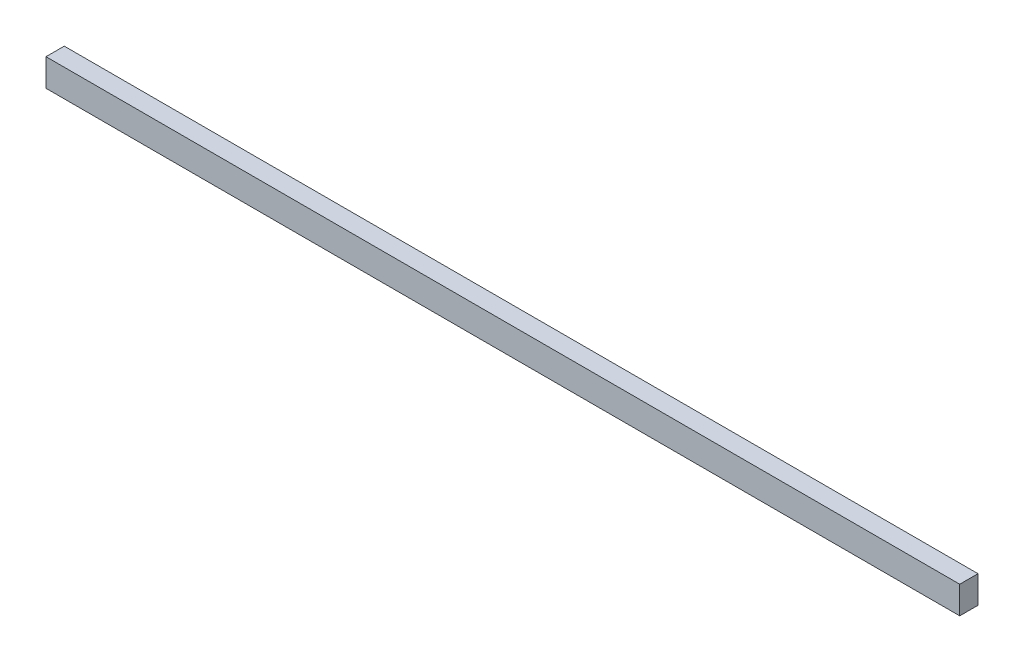
ISO-10303-21;
HEADER;
FILE_DESCRIPTION(('STEP AP214'),'2;1');
FILE_NAME('part.step','',(''),(''),'','','');
FILE_SCHEMA(('AUTOMOTIVE_DESIGN { 1 0 10303 214 1 1 1 1 }'));
ENDSEC;
DATA;
#1=APPLICATION_CONTEXT('core data for automotive mechanical design processes');
#2=APPLICATION_PROTOCOL_DEFINITION('international standard','automotive_design',2000,#1);
#3=PRODUCT_CONTEXT('',#1,'mechanical');
#4=PRODUCT('Part','Part','',(#3));
#5=PRODUCT_RELATED_PRODUCT_CATEGORY('part','',(#4));
#6=PRODUCT_DEFINITION_FORMATION('','',#4);
#7=PRODUCT_DEFINITION_CONTEXT('part definition',#1,'design');
#8=PRODUCT_DEFINITION('design','',#6,#7);
#9=PRODUCT_DEFINITION_SHAPE('','',#8);
#10=(LENGTH_UNIT() NAMED_UNIT(*) SI_UNIT(.MILLI.,.METRE.));
#11=(NAMED_UNIT(*) PLANE_ANGLE_UNIT() SI_UNIT($,.RADIAN.));
#12=(NAMED_UNIT(*) SI_UNIT($,.STERADIAN.) SOLID_ANGLE_UNIT());
#13=UNCERTAINTY_MEASURE_WITH_UNIT(LENGTH_MEASURE(1.E-05),#10,'distance_accuracy_value','');
#14=(GEOMETRIC_REPRESENTATION_CONTEXT(3) GLOBAL_UNCERTAINTY_ASSIGNED_CONTEXT((#13)) GLOBAL_UNIT_ASSIGNED_CONTEXT((#10,
#11,#12)) REPRESENTATION_CONTEXT('',''));
#15=CARTESIAN_POINT('',(0.,0.,0.));
#16=DIRECTION('',(0.,0.,1.));
#17=DIRECTION('',(1.,0.,0.));
#18=AXIS2_PLACEMENT_3D('',#15,#16,#17);
#19=CARTESIAN_POINT('',(1.,0.0149999999999994,-0.0100000000000061));
#20=DIRECTION('',(0.,0.,1.));
#21=DIRECTION('',(0.,-1.,0.));
#22=AXIS2_PLACEMENT_3D('',#19,#20,#21);
#23=PLANE('',#22);
#24=DIRECTION('',(0.,1.,0.));
#25=VECTOR('',#24,1.);
#26=CARTESIAN_POINT('',(0.,0.0149999999999994,-0.0100000000000061));
#27=LINE('',#26,#25);
#28=CARTESIAN_POINT('',(0.,-0.0149999999999994,-0.0100000000000061));
#29=VERTEX_POINT('',#28);
#30=CARTESIAN_POINT('',(0.,0.0149999999999994,-0.0100000000000061));
#31=VERTEX_POINT('',#30);
#32=EDGE_CURVE('E99',#29,#31,#27,.T.);
#33=ORIENTED_EDGE('',*,*,#32,.T.);
#34=DIRECTION('',(-1.,0.,0.));
#35=VECTOR('',#34,1.);
#36=CARTESIAN_POINT('',(1.,0.0149999999999994,-0.0100000000000061));
#37=LINE('',#36,#35);
#38=CARTESIAN_POINT('',(1.,0.0149999999999994,-0.0100000000000061));
#39=VERTEX_POINT('',#38);
#40=EDGE_CURVE('E11',#39,#31,#37,.T.);
#41=ORIENTED_EDGE('',*,*,#40,.F.);
#42=DIRECTION('',(0.,1.,0.));
#43=VECTOR('',#42,1.);
#44=CARTESIAN_POINT('',(1.,0.0149999999999994,-0.0100000000000061));
#45=LINE('',#44,#43);
#46=CARTESIAN_POINT('',(1.,-0.0149999999999994,-0.0100000000000061));
#47=VERTEX_POINT('',#46);
#48=EDGE_CURVE('E87',#47,#39,#45,.T.);
#49=ORIENTED_EDGE('',*,*,#48,.F.);
#50=DIRECTION('',(-1.,0.,0.));
#51=VECTOR('',#50,1.);
#52=CARTESIAN_POINT('',(1.,-0.0149999999999994,-0.0100000000000061));
#53=LINE('',#52,#51);
#54=EDGE_CURVE('E95',#47,#29,#53,.T.);
#55=ORIENTED_EDGE('',*,*,#54,.T.);
#56=EDGE_LOOP('',(#33,#41,#49,#55));
#57=FACE_BOUND('',#56,.T.);
#58=ADVANCED_FACE('F36',(#57),#23,.F.);
#59=CARTESIAN_POINT('',(1.,0.0149999999999994,0.0100000000000061));
#60=DIRECTION('',(0.,-1.,0.));
#61=DIRECTION('',(0.,0.,-1.));
#62=AXIS2_PLACEMENT_3D('',#59,#60,#61);
#63=PLANE('',#62);
#64=DIRECTION('',(0.,0.,1.));
#65=VECTOR('',#64,1.);
#66=CARTESIAN_POINT('',(0.,0.0149999999999994,0.0100000000000061));
#67=LINE('',#66,#65);
#68=CARTESIAN_POINT('',(0.,0.0149999999999994,0.0100000000000061));
#69=VERTEX_POINT('',#68);
#70=EDGE_CURVE('E91',#31,#69,#67,.T.);
#71=ORIENTED_EDGE('',*,*,#70,.T.);
#72=DIRECTION('',(-1.,0.,0.));
#73=VECTOR('',#72,1.);
#74=CARTESIAN_POINT('',(1.,0.0149999999999994,0.0100000000000061));
#75=LINE('',#74,#73);
#76=CARTESIAN_POINT('',(1.,0.0149999999999994,0.0100000000000061));
#77=VERTEX_POINT('',#76);
#78=EDGE_CURVE('E44',#77,#69,#75,.T.);
#79=ORIENTED_EDGE('',*,*,#78,.F.);
#80=DIRECTION('',(0.,0.,1.));
#81=VECTOR('',#80,1.);
#82=CARTESIAN_POINT('',(1.,0.0149999999999994,0.0100000000000061));
#83=LINE('',#82,#81);
#84=EDGE_CURVE('E82',#39,#77,#83,.T.);
#85=ORIENTED_EDGE('',*,*,#84,.F.);
#86=ORIENTED_EDGE('',*,*,#40,.T.);
#87=EDGE_LOOP('',(#71,#79,#85,#86));
#88=FACE_BOUND('',#87,.T.);
#89=ADVANCED_FACE('F90',(#88),#63,.F.);
#90=CARTESIAN_POINT('',(1.,0.0149999999999994,0.0100000000000061));
#91=DIRECTION('',(0.,0.,-1.));
#92=DIRECTION('',(0.,1.,0.));
#93=AXIS2_PLACEMENT_3D('',#90,#91,#92);
#94=PLANE('',#93);
#95=DIRECTION('',(0.,-1.,0.));
#96=VECTOR('',#95,1.);
#97=CARTESIAN_POINT('',(0.,0.0149999999999994,0.0100000000000061));
#98=LINE('',#97,#96);
#99=CARTESIAN_POINT('',(0.,-0.0149999999999994,0.0100000000000061));
#100=VERTEX_POINT('',#99);
#101=EDGE_CURVE('E69',#69,#100,#98,.T.);
#102=ORIENTED_EDGE('',*,*,#101,.T.);
#103=DIRECTION('',(-1.,0.,0.));
#104=VECTOR('',#103,1.);
#105=CARTESIAN_POINT('',(1.,-0.0149999999999994,0.0100000000000061));
#106=LINE('',#105,#104);
#107=CARTESIAN_POINT('',(1.,-0.0149999999999994,0.0100000000000061));
#108=VERTEX_POINT('',#107);
#109=EDGE_CURVE('E92',#108,#100,#106,.T.);
#110=ORIENTED_EDGE('',*,*,#109,.F.);
#111=DIRECTION('',(0.,-1.,0.));
#112=VECTOR('',#111,1.);
#113=CARTESIAN_POINT('',(1.,0.0149999999999994,0.0100000000000061));
#114=LINE('',#113,#112);
#115=EDGE_CURVE('E85',#77,#108,#114,.T.);
#116=ORIENTED_EDGE('',*,*,#115,.F.);
#117=ORIENTED_EDGE('',*,*,#78,.T.);
#118=EDGE_LOOP('',(#102,#110,#116,#117));
#119=FACE_BOUND('',#118,.T.);
#120=ADVANCED_FACE('F93',(#119),#94,.F.);
#121=CARTESIAN_POINT('',(1.,-0.0149999999999994,0.0100000000000061));
#122=DIRECTION('',(0.,1.,0.));
#123=DIRECTION('',(0.,0.,1.));
#124=AXIS2_PLACEMENT_3D('',#121,#122,#123);
#125=PLANE('',#124);
#126=DIRECTION('',(0.,0.,-1.));
#127=VECTOR('',#126,1.);
#128=CARTESIAN_POINT('',(0.,-0.0149999999999994,0.0100000000000061));
#129=LINE('',#128,#127);
#130=EDGE_CURVE('E75',#100,#29,#129,.T.);
#131=ORIENTED_EDGE('',*,*,#130,.T.);
#132=ORIENTED_EDGE('',*,*,#54,.F.);
#133=DIRECTION('',(0.,0.,-1.));
#134=VECTOR('',#133,1.);
#135=CARTESIAN_POINT('',(1.,-0.0149999999999994,0.0100000000000061));
#136=LINE('',#135,#134);
#137=EDGE_CURVE('E52',#108,#47,#136,.T.);
#138=ORIENTED_EDGE('',*,*,#137,.F.);
#139=ORIENTED_EDGE('',*,*,#109,.T.);
#140=EDGE_LOOP('',(#131,#132,#138,#139));
#141=FACE_BOUND('',#140,.T.);
#142=ADVANCED_FACE('F106',(#141),#125,.F.);
#143=CARTESIAN_POINT('',(1.,0.,0.));
#144=DIRECTION('',(1.,0.,0.));
#145=DIRECTION('',(0.,0.,-1.));
#146=AXIS2_PLACEMENT_3D('',#143,#144,#145);
#147=PLANE('',#146);
#148=ORIENTED_EDGE('',*,*,#48,.T.);
#149=ORIENTED_EDGE('',*,*,#84,.T.);
#150=ORIENTED_EDGE('',*,*,#115,.T.);
#151=ORIENTED_EDGE('',*,*,#137,.T.);
#152=EDGE_LOOP('',(#148,#149,#150,#151));
#153=FACE_BOUND('',#152,.T.);
#154=ADVANCED_FACE('F83',(#153),#147,.T.);
#155=CARTESIAN_POINT('',(0.,0.,0.));
#156=DIRECTION('',(1.,0.,0.));
#157=DIRECTION('',(0.,0.,-1.));
#158=AXIS2_PLACEMENT_3D('',#155,#156,#157);
#159=PLANE('',#158);
#160=ORIENTED_EDGE('',*,*,#32,.F.);
#161=ORIENTED_EDGE('',*,*,#130,.F.);
#162=ORIENTED_EDGE('',*,*,#101,.F.);
#163=ORIENTED_EDGE('',*,*,#70,.F.);
#164=EDGE_LOOP('',(#160,#161,#162,#163));
#165=FACE_BOUND('',#164,.T.);
#166=ADVANCED_FACE('F109',(#165),#159,.F.);
#167=CLOSED_SHELL('',(#58,#89,#120,#142,#154,#166));
#168=MANIFOLD_SOLID_BREP('B2',#167);
#169=ADVANCED_BREP_SHAPE_REPRESENTATION('',(#18,#168),#14);
#170=SHAPE_DEFINITION_REPRESENTATION(#9,#169);
ENDSEC;
END-ISO-10303-21;
